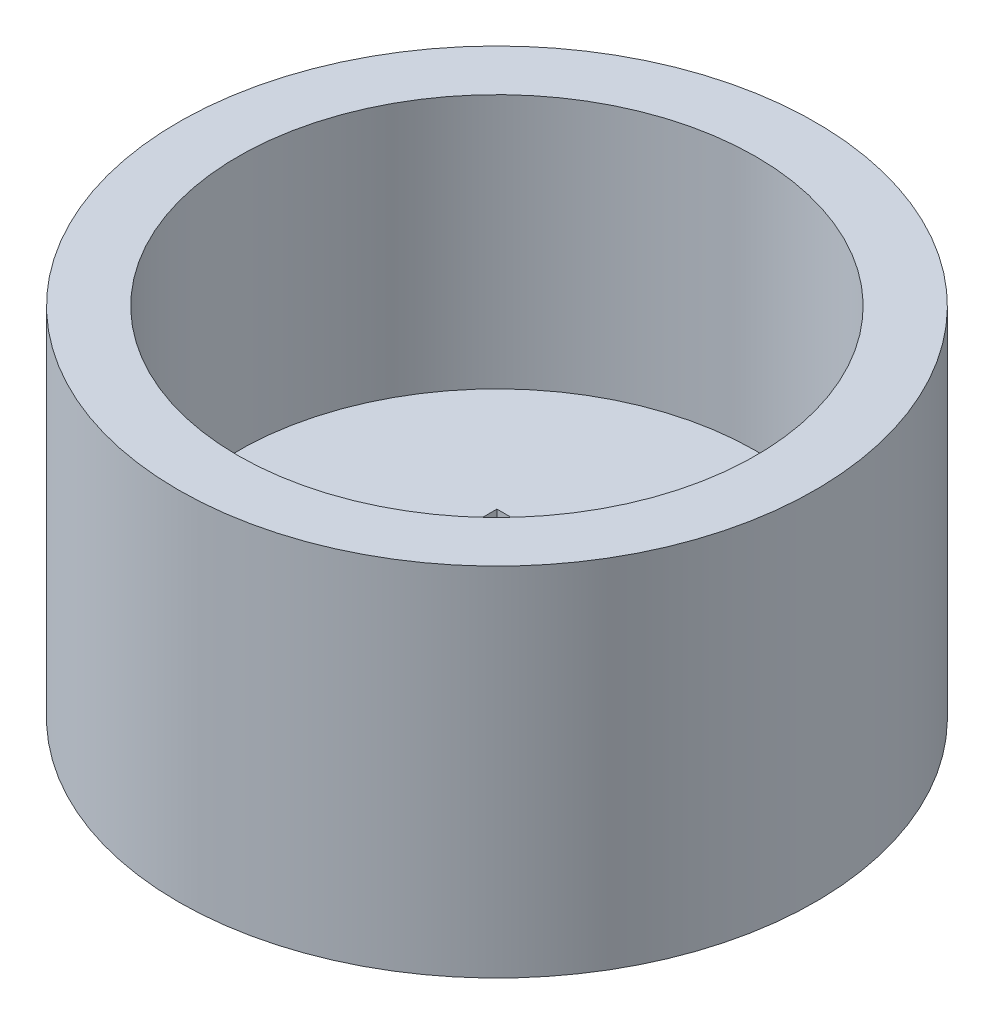
ISO-10303-21;
HEADER;
FILE_DESCRIPTION(('STEP AP214'),'2;1');
FILE_NAME('part.step','',(''),(''),'','','');
FILE_SCHEMA(('AUTOMOTIVE_DESIGN { 1 0 10303 214 1 1 1 1 }'));
ENDSEC;
DATA;
#1=APPLICATION_CONTEXT('core data for automotive mechanical design processes');
#2=APPLICATION_PROTOCOL_DEFINITION('international standard','automotive_design',2000,#1);
#3=PRODUCT_CONTEXT('',#1,'mechanical');
#4=PRODUCT('Part','Part','',(#3));
#5=PRODUCT_RELATED_PRODUCT_CATEGORY('part','',(#4));
#6=PRODUCT_DEFINITION_FORMATION('','',#4);
#7=PRODUCT_DEFINITION_CONTEXT('part definition',#1,'design');
#8=PRODUCT_DEFINITION('design','',#6,#7);
#9=PRODUCT_DEFINITION_SHAPE('','',#8);
#10=(LENGTH_UNIT() NAMED_UNIT(*) SI_UNIT(.MILLI.,.METRE.));
#11=(NAMED_UNIT(*) PLANE_ANGLE_UNIT() SI_UNIT($,.RADIAN.));
#12=(NAMED_UNIT(*) SI_UNIT($,.STERADIAN.) SOLID_ANGLE_UNIT());
#13=UNCERTAINTY_MEASURE_WITH_UNIT(LENGTH_MEASURE(1.E-05),#10,'distance_accuracy_value','');
#14=(GEOMETRIC_REPRESENTATION_CONTEXT(3) GLOBAL_UNCERTAINTY_ASSIGNED_CONTEXT((#13)) GLOBAL_UNIT_ASSIGNED_CONTEXT((#10,
#11,#12)) REPRESENTATION_CONTEXT('',''));
#15=CARTESIAN_POINT('',(0.,0.,0.));
#16=DIRECTION('',(0.,0.,1.));
#17=DIRECTION('',(1.,0.,0.));
#18=AXIS2_PLACEMENT_3D('',#15,#16,#17);
#19=CARTESIAN_POINT('',(0.,-8.,0.));
#20=DIRECTION('',(0.,1.,0.));
#21=DIRECTION('',(0.,0.,1.));
#22=AXIS2_PLACEMENT_3D('',#19,#20,#21);
#23=PLANE('',#22);
#24=CARTESIAN_POINT('',(0.,-8.,0.));
#25=DIRECTION('',(0.,1.,0.));
#26=DIRECTION('',(0.,0.,1.));
#27=AXIS2_PLACEMENT_3D('',#24,#25,#26);
#28=CIRCLE('',#27,25.);
#29=CARTESIAN_POINT('',(0.,-8.,25.));
#30=VERTEX_POINT('',#29);
#31=EDGE_CURVE('E118',#30,#30,#28,.T.);
#32=ORIENTED_EDGE('',*,*,#31,.F.);
#33=EDGE_LOOP('',(#32));
#34=FACE_BOUND('',#33,.T.);
#35=DIRECTION('',(-1.,0.,0.));
#36=VECTOR('',#35,1.);
#37=CARTESIAN_POINT('',(0.,-8.,-11.));
#38=LINE('',#37,#36);
#39=CARTESIAN_POINT('',(6.2,-8.,-11.));
#40=VERTEX_POINT('',#39);
#41=CARTESIAN_POINT('',(-6.2,-8.,-11.));
#42=VERTEX_POINT('',#41);
#43=EDGE_CURVE('E95',#40,#42,#38,.T.);
#44=ORIENTED_EDGE('',*,*,#43,.T.);
#45=DIRECTION('',(0.,0.,-1.));
#46=VECTOR('',#45,1.);
#47=CARTESIAN_POINT('',(-6.2,-8.,0.));
#48=LINE('',#47,#46);
#49=CARTESIAN_POINT('',(-6.2,-8.,21.1));
#50=VERTEX_POINT('',#49);
#51=EDGE_CURVE('E225',#50,#42,#48,.T.);
#52=ORIENTED_EDGE('',*,*,#51,.F.);
#53=DIRECTION('',(-1.,0.,0.));
#54=VECTOR('',#53,1.);
#55=CARTESIAN_POINT('',(0.,-8.,21.1));
#56=LINE('',#55,#54);
#57=CARTESIAN_POINT('',(6.2,-8.,21.1));
#58=VERTEX_POINT('',#57);
#59=EDGE_CURVE('E96',#58,#50,#56,.T.);
#60=ORIENTED_EDGE('',*,*,#59,.F.);
#61=DIRECTION('',(0.,0.,-1.));
#62=VECTOR('',#61,1.);
#63=CARTESIAN_POINT('',(6.2,-8.,0.));
#64=LINE('',#63,#62);
#65=EDGE_CURVE('E92',#58,#40,#64,.T.);
#66=ORIENTED_EDGE('',*,*,#65,.T.);
#67=EDGE_LOOP('',(#44,#52,#60,#66));
#68=FACE_BOUND('',#67,.T.);
#69=ADVANCED_FACE('F41',(#34,#68),#23,.F.);
#70=CARTESIAN_POINT('',(0.,20.,0.));
#71=DIRECTION('',(0.,1.,0.));
#72=DIRECTION('',(0.,0.,1.));
#73=AXIS2_PLACEMENT_3D('',#70,#71,#72);
#74=PLANE('',#73);
#75=CARTESIAN_POINT('',(0.,20.,0.));
#76=DIRECTION('',(0.,1.,0.));
#77=DIRECTION('',(0.,0.,1.));
#78=AXIS2_PLACEMENT_3D('',#75,#76,#77);
#79=CIRCLE('',#78,25.);
#80=CARTESIAN_POINT('',(0.,20.,25.));
#81=VERTEX_POINT('',#80);
#82=EDGE_CURVE('E11',#81,#81,#79,.T.);
#83=ORIENTED_EDGE('',*,*,#82,.T.);
#84=EDGE_LOOP('',(#83));
#85=FACE_BOUND('',#84,.T.);
#86=CARTESIAN_POINT('',(0.,20.,0.));
#87=DIRECTION('',(0.,1.,0.));
#88=DIRECTION('',(0.,0.,1.));
#89=AXIS2_PLACEMENT_3D('',#86,#87,#88);
#90=CIRCLE('',#89,20.325);
#91=CARTESIAN_POINT('',(0.,20.,20.325));
#92=VERTEX_POINT('',#91);
#93=EDGE_CURVE('E49',#92,#92,#90,.T.);
#94=ORIENTED_EDGE('',*,*,#93,.F.);
#95=EDGE_LOOP('',(#94));
#96=FACE_BOUND('',#95,.T.);
#97=ADVANCED_FACE('F138',(#85,#96),#74,.T.);
#98=CARTESIAN_POINT('',(0.,20.,0.));
#99=DIRECTION('',(0.,-1.,0.));
#100=DIRECTION('',(0.,0.,-1.));
#101=AXIS2_PLACEMENT_3D('',#98,#99,#100);
#102=CYLINDRICAL_SURFACE('',#101,25.);
#103=ORIENTED_EDGE('',*,*,#82,.F.);
#104=EDGE_LOOP('',(#103));
#105=FACE_BOUND('',#104,.T.);
#106=ORIENTED_EDGE('',*,*,#31,.T.);
#107=EDGE_LOOP('',(#106));
#108=FACE_BOUND('',#107,.T.);
#109=ADVANCED_FACE('F43',(#105,#108),#102,.T.);
#110=CARTESIAN_POINT('',(0.,20.,0.));
#111=DIRECTION('',(0.,-1.,0.));
#112=DIRECTION('',(0.,0.,-1.));
#113=AXIS2_PLACEMENT_3D('',#110,#111,#112);
#114=CYLINDRICAL_SURFACE('',#113,20.325);
#115=ORIENTED_EDGE('',*,*,#93,.T.);
#116=EDGE_LOOP('',(#115));
#117=FACE_BOUND('',#116,.T.);
#118=CARTESIAN_POINT('',(0.,0.,0.));
#119=DIRECTION('',(0.,1.,0.));
#120=DIRECTION('',(0.,0.,1.));
#121=AXIS2_PLACEMENT_3D('',#118,#119,#120);
#122=CIRCLE('',#121,20.325);
#123=CARTESIAN_POINT('',(0.,0.,20.325));
#124=VERTEX_POINT('',#123);
#125=EDGE_CURVE('E121',#124,#124,#122,.T.);
#126=ORIENTED_EDGE('',*,*,#125,.F.);
#127=EDGE_LOOP('',(#126));
#128=FACE_BOUND('',#127,.T.);
#129=ADVANCED_FACE('F128',(#117,#128),#114,.F.);
#130=CARTESIAN_POINT('',(0.,0.,0.));
#131=DIRECTION('',(0.,1.,0.));
#132=DIRECTION('',(0.,0.,1.));
#133=AXIS2_PLACEMENT_3D('',#130,#131,#132);
#134=PLANE('',#133);
#135=CARTESIAN_POINT('',(0.,0.,18.7));
#136=DIRECTION('',(0.,1.,0.));
#137=DIRECTION('',(0.,0.,1.));
#138=AXIS2_PLACEMENT_3D('',#135,#136,#137);
#139=CIRCLE('',#138,1.325);
#140=CARTESIAN_POINT('',(0.,0.,20.025));
#141=VERTEX_POINT('',#140);
#142=EDGE_CURVE('E187',#141,#141,#139,.T.);
#143=ORIENTED_EDGE('',*,*,#142,.F.);
#144=EDGE_LOOP('',(#143));
#145=FACE_BOUND('',#144,.T.);
#146=CARTESIAN_POINT('',(0.,0.,-8.6));
#147=DIRECTION('',(0.,1.,0.));
#148=DIRECTION('',(0.,0.,1.));
#149=AXIS2_PLACEMENT_3D('',#146,#147,#148);
#150=CIRCLE('',#149,1.325);
#151=CARTESIAN_POINT('',(0.,0.,-7.275));
#152=VERTEX_POINT('',#151);
#153=EDGE_CURVE('E197',#152,#152,#150,.T.);
#154=ORIENTED_EDGE('',*,*,#153,.F.);
#155=EDGE_LOOP('',(#154));
#156=FACE_BOUND('',#155,.T.);
#157=DIRECTION('',(0.,0.,1.));
#158=VECTOR('',#157,1.);
#159=CARTESIAN_POINT('',(-6.2,0.,0.));
#160=LINE('',#159,#158);
#161=CARTESIAN_POINT('',(-6.2,0.,-6.2));
#162=VERTEX_POINT('',#161);
#163=CARTESIAN_POINT('',(-6.2,0.,16.3));
#164=VERTEX_POINT('',#163);
#165=EDGE_CURVE('E216',#162,#164,#160,.T.);
#166=ORIENTED_EDGE('',*,*,#165,.F.);
#167=DIRECTION('',(1.,0.,0.));
#168=VECTOR('',#167,1.);
#169=CARTESIAN_POINT('',(0.,0.,-6.2));
#170=LINE('',#169,#168);
#171=CARTESIAN_POINT('',(6.2,0.,-6.2));
#172=VERTEX_POINT('',#171);
#173=EDGE_CURVE('E108',#162,#172,#170,.T.);
#174=ORIENTED_EDGE('',*,*,#173,.T.);
#175=DIRECTION('',(0.,0.,1.));
#176=VECTOR('',#175,1.);
#177=CARTESIAN_POINT('',(6.2,0.,0.));
#178=LINE('',#177,#176);
#179=CARTESIAN_POINT('',(6.2,0.,16.3));
#180=VERTEX_POINT('',#179);
#181=EDGE_CURVE('E213',#172,#180,#178,.T.);
#182=ORIENTED_EDGE('',*,*,#181,.T.);
#183=DIRECTION('',(1.,0.,0.));
#184=VECTOR('',#183,1.);
#185=CARTESIAN_POINT('',(0.,0.,16.3));
#186=LINE('',#185,#184);
#187=EDGE_CURVE('E204',#164,#180,#186,.T.);
#188=ORIENTED_EDGE('',*,*,#187,.F.);
#189=EDGE_LOOP('',(#166,#174,#182,#188));
#190=FACE_BOUND('',#189,.T.);
#191=ORIENTED_EDGE('',*,*,#125,.T.);
#192=EDGE_LOOP('',(#191));
#193=FACE_BOUND('',#192,.T.);
#194=ADVANCED_FACE('F126',(#145,#156,#190,#193),#134,.T.);
#195=CARTESIAN_POINT('',(0.,-5.3,-11.));
#196=DIRECTION('',(0.,0.,1.));
#197=DIRECTION('',(1.,0.,0.));
#198=AXIS2_PLACEMENT_3D('',#195,#196,#197);
#199=PLANE('',#198);
#200=ORIENTED_EDGE('',*,*,#43,.F.);
#201=DIRECTION('',(0.,-1.,0.));
#202=VECTOR('',#201,1.);
#203=CARTESIAN_POINT('',(6.2,-5.3,-11.));
#204=LINE('',#203,#202);
#205=CARTESIAN_POINT('',(6.2,-5.3,-11.));
#206=VERTEX_POINT('',#205);
#207=EDGE_CURVE('E99',#206,#40,#204,.T.);
#208=ORIENTED_EDGE('',*,*,#207,.F.);
#209=DIRECTION('',(-1.,0.,0.));
#210=VECTOR('',#209,1.);
#211=CARTESIAN_POINT('',(0.,-5.3,-11.));
#212=LINE('',#211,#210);
#213=CARTESIAN_POINT('',(-6.2,-5.3,-11.));
#214=VERTEX_POINT('',#213);
#215=EDGE_CURVE('E243',#206,#214,#212,.T.);
#216=ORIENTED_EDGE('',*,*,#215,.T.);
#217=DIRECTION('',(0.,-1.,0.));
#218=VECTOR('',#217,1.);
#219=CARTESIAN_POINT('',(-6.2,-5.3,-11.));
#220=LINE('',#219,#218);
#221=EDGE_CURVE('E106',#214,#42,#220,.T.);
#222=ORIENTED_EDGE('',*,*,#221,.T.);
#223=EDGE_LOOP('',(#200,#208,#216,#222));
#224=FACE_BOUND('',#223,.T.);
#225=ADVANCED_FACE('F104',(#224),#199,.T.);
#226=CARTESIAN_POINT('',(0.,-5.3,0.));
#227=DIRECTION('',(0.,-1.,0.));
#228=DIRECTION('',(0.,0.,-1.));
#229=AXIS2_PLACEMENT_3D('',#226,#227,#228);
#230=PLANE('',#229);
#231=CARTESIAN_POINT('',(0.,-5.3,-8.6));
#232=DIRECTION('',(0.,-1.,0.));
#233=DIRECTION('',(0.,0.,-1.));
#234=AXIS2_PLACEMENT_3D('',#231,#232,#233);
#235=CIRCLE('',#234,1.325);
#236=CARTESIAN_POINT('',(0.,-5.3,-9.925));
#237=VERTEX_POINT('',#236);
#238=EDGE_CURVE('E192',#237,#237,#235,.T.);
#239=ORIENTED_EDGE('',*,*,#238,.F.);
#240=EDGE_LOOP('',(#239));
#241=FACE_BOUND('',#240,.T.);
#242=DIRECTION('',(-1.,0.,0.));
#243=VECTOR('',#242,1.);
#244=CARTESIAN_POINT('',(0.,-5.3,-6.2));
#245=LINE('',#244,#243);
#246=CARTESIAN_POINT('',(6.2,-5.3,-6.2));
#247=VERTEX_POINT('',#246);
#248=CARTESIAN_POINT('',(-6.2,-5.3,-6.2));
#249=VERTEX_POINT('',#248);
#250=EDGE_CURVE('E107',#247,#249,#245,.T.);
#251=ORIENTED_EDGE('',*,*,#250,.T.);
#252=DIRECTION('',(0.,0.,-1.));
#253=VECTOR('',#252,1.);
#254=CARTESIAN_POINT('',(-6.2,-5.3,0.));
#255=LINE('',#254,#253);
#256=EDGE_CURVE('E240',#249,#214,#255,.T.);
#257=ORIENTED_EDGE('',*,*,#256,.T.);
#258=ORIENTED_EDGE('',*,*,#215,.F.);
#259=DIRECTION('',(0.,0.,-1.));
#260=VECTOR('',#259,1.);
#261=CARTESIAN_POINT('',(6.2,-5.3,0.));
#262=LINE('',#261,#260);
#263=EDGE_CURVE('E113',#247,#206,#262,.T.);
#264=ORIENTED_EDGE('',*,*,#263,.F.);
#265=EDGE_LOOP('',(#251,#257,#258,#264));
#266=FACE_BOUND('',#265,.T.);
#267=ADVANCED_FACE('F151',(#241,#266),#230,.T.);
#268=CARTESIAN_POINT('',(-6.2,-5.3,0.));
#269=DIRECTION('',(-1.,0.,0.));
#270=DIRECTION('',(0.,0.,1.));
#271=AXIS2_PLACEMENT_3D('',#268,#269,#270);
#272=PLANE('',#271);
#273=ORIENTED_EDGE('',*,*,#51,.T.);
#274=ORIENTED_EDGE('',*,*,#221,.F.);
#275=ORIENTED_EDGE('',*,*,#256,.F.);
#276=DIRECTION('',(0.,-1.,0.));
#277=VECTOR('',#276,1.);
#278=CARTESIAN_POINT('',(-6.2,36.7,-6.2));
#279=LINE('',#278,#277);
#280=EDGE_CURVE('E200',#162,#249,#279,.T.);
#281=ORIENTED_EDGE('',*,*,#280,.F.);
#282=ORIENTED_EDGE('',*,*,#165,.T.);
#283=DIRECTION('',(0.,-1.,0.));
#284=VECTOR('',#283,1.);
#285=CARTESIAN_POINT('',(-6.2,36.7,16.3));
#286=LINE('',#285,#284);
#287=CARTESIAN_POINT('',(-6.2,-5.3,16.3));
#288=VERTEX_POINT('',#287);
#289=EDGE_CURVE('E201',#164,#288,#286,.T.);
#290=ORIENTED_EDGE('',*,*,#289,.T.);
#291=DIRECTION('',(0.,0.,-1.));
#292=VECTOR('',#291,1.);
#293=CARTESIAN_POINT('',(-6.2,-5.3,0.));
#294=LINE('',#293,#292);
#295=CARTESIAN_POINT('',(-6.2,-5.3,21.1));
#296=VERTEX_POINT('',#295);
#297=EDGE_CURVE('E230',#296,#288,#294,.T.);
#298=ORIENTED_EDGE('',*,*,#297,.F.);
#299=DIRECTION('',(0.,-1.,0.));
#300=VECTOR('',#299,1.);
#301=CARTESIAN_POINT('',(-6.2,-5.3,21.1));
#302=LINE('',#301,#300);
#303=EDGE_CURVE('E65',#296,#50,#302,.T.);
#304=ORIENTED_EDGE('',*,*,#303,.T.);
#305=EDGE_LOOP('',(#273,#274,#275,#281,#282,#290,#298,#304));
#306=FACE_BOUND('',#305,.T.);
#307=ADVANCED_FACE('F154',(#306),#272,.F.);
#308=CARTESIAN_POINT('',(0.,-5.3,21.1));
#309=DIRECTION('',(0.,0.,1.));
#310=DIRECTION('',(1.,0.,0.));
#311=AXIS2_PLACEMENT_3D('',#308,#309,#310);
#312=PLANE('',#311);
#313=ORIENTED_EDGE('',*,*,#59,.T.);
#314=ORIENTED_EDGE('',*,*,#303,.F.);
#315=DIRECTION('',(-1.,0.,0.));
#316=VECTOR('',#315,1.);
#317=CARTESIAN_POINT('',(0.,-5.3,21.1));
#318=LINE('',#317,#316);
#319=CARTESIAN_POINT('',(6.2,-5.3,21.1));
#320=VERTEX_POINT('',#319);
#321=EDGE_CURVE('E228',#320,#296,#318,.T.);
#322=ORIENTED_EDGE('',*,*,#321,.F.);
#323=DIRECTION('',(0.,-1.,0.));
#324=VECTOR('',#323,1.);
#325=CARTESIAN_POINT('',(6.2,-5.3,21.1));
#326=LINE('',#325,#324);
#327=EDGE_CURVE('E232',#320,#58,#326,.T.);
#328=ORIENTED_EDGE('',*,*,#327,.T.);
#329=EDGE_LOOP('',(#313,#314,#322,#328));
#330=FACE_BOUND('',#329,.T.);
#331=ADVANCED_FACE('F159',(#330),#312,.F.);
#332=CARTESIAN_POINT('',(6.2,-5.3,0.));
#333=DIRECTION('',(-1.,0.,0.));
#334=DIRECTION('',(0.,0.,1.));
#335=AXIS2_PLACEMENT_3D('',#332,#333,#334);
#336=PLANE('',#335);
#337=ORIENTED_EDGE('',*,*,#65,.F.);
#338=ORIENTED_EDGE('',*,*,#327,.F.);
#339=DIRECTION('',(0.,0.,-1.));
#340=VECTOR('',#339,1.);
#341=CARTESIAN_POINT('',(6.2,-5.3,0.));
#342=LINE('',#341,#340);
#343=CARTESIAN_POINT('',(6.2,-5.3,16.3));
#344=VERTEX_POINT('',#343);
#345=EDGE_CURVE('E224',#320,#344,#342,.T.);
#346=ORIENTED_EDGE('',*,*,#345,.T.);
#347=DIRECTION('',(0.,-1.,0.));
#348=VECTOR('',#347,1.);
#349=CARTESIAN_POINT('',(6.2,36.7,16.3));
#350=LINE('',#349,#348);
#351=EDGE_CURVE('E205',#180,#344,#350,.T.);
#352=ORIENTED_EDGE('',*,*,#351,.F.);
#353=ORIENTED_EDGE('',*,*,#181,.F.);
#354=DIRECTION('',(0.,-1.,0.));
#355=VECTOR('',#354,1.);
#356=CARTESIAN_POINT('',(6.2,36.7,-6.2));
#357=LINE('',#356,#355);
#358=EDGE_CURVE('E56',#172,#247,#357,.T.);
#359=ORIENTED_EDGE('',*,*,#358,.T.);
#360=ORIENTED_EDGE('',*,*,#263,.T.);
#361=ORIENTED_EDGE('',*,*,#207,.T.);
#362=EDGE_LOOP('',(#337,#338,#346,#352,#353,#359,#360,#361));
#363=FACE_BOUND('',#362,.T.);
#364=ADVANCED_FACE('F111',(#363),#336,.T.);
#365=CARTESIAN_POINT('',(0.,-5.3,0.));
#366=DIRECTION('',(0.,-1.,0.));
#367=DIRECTION('',(0.,0.,-1.));
#368=AXIS2_PLACEMENT_3D('',#365,#366,#367);
#369=PLANE('',#368);
#370=CARTESIAN_POINT('',(0.,-5.3,18.7));
#371=DIRECTION('',(0.,-1.,0.));
#372=DIRECTION('',(0.,0.,-1.));
#373=AXIS2_PLACEMENT_3D('',#370,#371,#372);
#374=CIRCLE('',#373,1.325);
#375=CARTESIAN_POINT('',(0.,-5.3,17.375));
#376=VERTEX_POINT('',#375);
#377=EDGE_CURVE('E190',#376,#376,#374,.T.);
#378=ORIENTED_EDGE('',*,*,#377,.F.);
#379=EDGE_LOOP('',(#378));
#380=FACE_BOUND('',#379,.T.);
#381=DIRECTION('',(-1.,0.,0.));
#382=VECTOR('',#381,1.);
#383=CARTESIAN_POINT('',(0.,-5.3,16.3));
#384=LINE('',#383,#382);
#385=EDGE_CURVE('E221',#344,#288,#384,.T.);
#386=ORIENTED_EDGE('',*,*,#385,.F.);
#387=ORIENTED_EDGE('',*,*,#345,.F.);
#388=ORIENTED_EDGE('',*,*,#321,.T.);
#389=ORIENTED_EDGE('',*,*,#297,.T.);
#390=EDGE_LOOP('',(#386,#387,#388,#389));
#391=FACE_BOUND('',#390,.T.);
#392=ADVANCED_FACE('F158',(#380,#391),#369,.T.);
#393=CARTESIAN_POINT('',(0.,36.7,16.3));
#394=DIRECTION('',(0.,0.,1.));
#395=DIRECTION('',(1.,0.,0.));
#396=AXIS2_PLACEMENT_3D('',#393,#394,#395);
#397=PLANE('',#396);
#398=ORIENTED_EDGE('',*,*,#187,.T.);
#399=ORIENTED_EDGE('',*,*,#351,.T.);
#400=ORIENTED_EDGE('',*,*,#385,.T.);
#401=ORIENTED_EDGE('',*,*,#289,.F.);
#402=EDGE_LOOP('',(#398,#399,#400,#401));
#403=FACE_BOUND('',#402,.T.);
#404=ADVANCED_FACE('F167',(#403),#397,.F.);
#405=CARTESIAN_POINT('',(0.,36.7,-6.2));
#406=DIRECTION('',(0.,0.,1.));
#407=DIRECTION('',(1.,0.,0.));
#408=AXIS2_PLACEMENT_3D('',#405,#406,#407);
#409=PLANE('',#408);
#410=ORIENTED_EDGE('',*,*,#280,.T.);
#411=ORIENTED_EDGE('',*,*,#250,.F.);
#412=ORIENTED_EDGE('',*,*,#358,.F.);
#413=ORIENTED_EDGE('',*,*,#173,.F.);
#414=EDGE_LOOP('',(#410,#411,#412,#413));
#415=FACE_BOUND('',#414,.T.);
#416=ADVANCED_FACE('F169',(#415),#409,.T.);
#417=CARTESIAN_POINT('',(0.,30.7,18.7));
#418=DIRECTION('',(0.,-1.,0.));
#419=DIRECTION('',(0.,0.,-1.));
#420=AXIS2_PLACEMENT_3D('',#417,#418,#419);
#421=CYLINDRICAL_SURFACE('',#420,1.325);
#422=ORIENTED_EDGE('',*,*,#142,.T.);
#423=EDGE_LOOP('',(#422));
#424=FACE_BOUND('',#423,.T.);
#425=ORIENTED_EDGE('',*,*,#377,.T.);
#426=EDGE_LOOP('',(#425));
#427=FACE_BOUND('',#426,.T.);
#428=ADVANCED_FACE('F172',(#424,#427),#421,.F.);
#429=CARTESIAN_POINT('',(0.,30.7,-8.6));
#430=DIRECTION('',(0.,-1.,0.));
#431=DIRECTION('',(0.,0.,-1.));
#432=AXIS2_PLACEMENT_3D('',#429,#430,#431);
#433=CYLINDRICAL_SURFACE('',#432,1.325);
#434=ORIENTED_EDGE('',*,*,#153,.T.);
#435=EDGE_LOOP('',(#434));
#436=FACE_BOUND('',#435,.T.);
#437=ORIENTED_EDGE('',*,*,#238,.T.);
#438=EDGE_LOOP('',(#437));
#439=FACE_BOUND('',#438,.T.);
#440=ADVANCED_FACE('F176',(#436,#439),#433,.F.);
#441=CLOSED_SHELL('',(#69,#97,#109,#129,#194,#225,#267,#307,#331,#364,#392,#404,#416,#428,#440));
#442=MANIFOLD_SOLID_BREP('B2',#441);
#443=ADVANCED_BREP_SHAPE_REPRESENTATION('',(#18,#442),#14);
#444=SHAPE_DEFINITION_REPRESENTATION(#9,#443);
ENDSEC;
END-ISO-10303-21;
